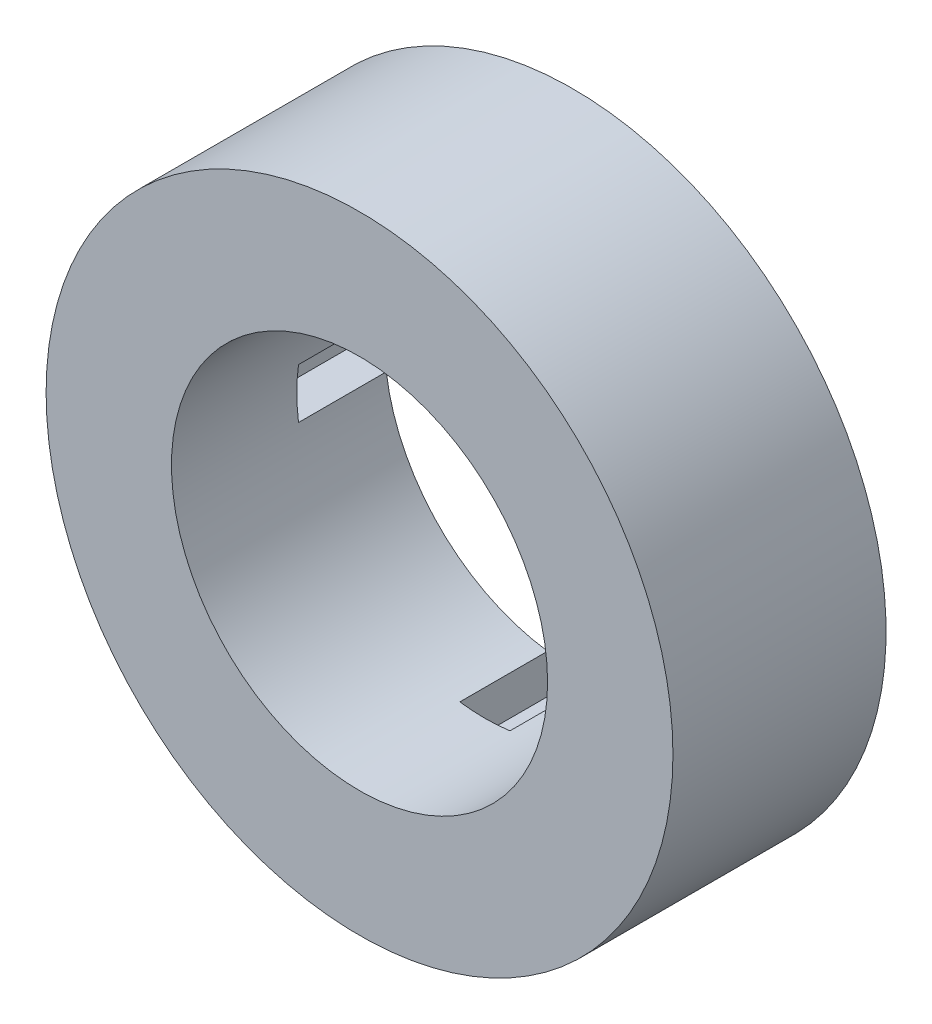
ISO-10303-21;
HEADER;
FILE_DESCRIPTION(('STEP AP214'),'2;1');
FILE_NAME('part.step','',(''),(''),'','','');
FILE_SCHEMA(('AUTOMOTIVE_DESIGN { 1 0 10303 214 1 1 1 1 }'));
ENDSEC;
DATA;
#1=APPLICATION_CONTEXT('core data for automotive mechanical design processes');
#2=APPLICATION_PROTOCOL_DEFINITION('international standard','automotive_design',2000,#1);
#3=PRODUCT_CONTEXT('',#1,'mechanical');
#4=PRODUCT('Part','Part','',(#3));
#5=PRODUCT_RELATED_PRODUCT_CATEGORY('part','',(#4));
#6=PRODUCT_DEFINITION_FORMATION('','',#4);
#7=PRODUCT_DEFINITION_CONTEXT('part definition',#1,'design');
#8=PRODUCT_DEFINITION('design','',#6,#7);
#9=PRODUCT_DEFINITION_SHAPE('','',#8);
#10=(LENGTH_UNIT() NAMED_UNIT(*) SI_UNIT(.MILLI.,.METRE.));
#11=(NAMED_UNIT(*) PLANE_ANGLE_UNIT() SI_UNIT($,.RADIAN.));
#12=(NAMED_UNIT(*) SI_UNIT($,.STERADIAN.) SOLID_ANGLE_UNIT());
#13=UNCERTAINTY_MEASURE_WITH_UNIT(LENGTH_MEASURE(1.E-05),#10,'distance_accuracy_value','');
#14=(GEOMETRIC_REPRESENTATION_CONTEXT(3) GLOBAL_UNCERTAINTY_ASSIGNED_CONTEXT((#13)) GLOBAL_UNIT_ASSIGNED_CONTEXT((#10,
#11,#12)) REPRESENTATION_CONTEXT('',''));
#15=CARTESIAN_POINT('',(0.,0.,0.));
#16=DIRECTION('',(0.,0.,1.));
#17=DIRECTION('',(1.,0.,0.));
#18=AXIS2_PLACEMENT_3D('',#15,#16,#17);
#19=CARTESIAN_POINT('',(0.,0.,5.));
#20=DIRECTION('',(0.,0.,-1.));
#21=DIRECTION('',(-1.,0.,0.));
#22=AXIS2_PLACEMENT_3D('',#19,#20,#21);
#23=CYLINDRICAL_SURFACE('',#22,3.75);
#24=CARTESIAN_POINT('',(0.,0.,5.));
#25=DIRECTION('',(0.,0.,1.));
#26=DIRECTION('',(1.,0.,0.));
#27=AXIS2_PLACEMENT_3D('',#24,#25,#26);
#28=CIRCLE('',#27,3.75);
#29=CARTESIAN_POINT('',(3.75,0.,5.));
#30=VERTEX_POINT('',#29);
#31=EDGE_CURVE('E263',#30,#30,#28,.T.);
#32=ORIENTED_EDGE('',*,*,#31,.T.);
#33=EDGE_LOOP('',(#32));
#34=FACE_BOUND('',#33,.T.);
#35=DIRECTION('',(0.,0.,-1.));
#36=VECTOR('',#35,1.);
#37=CARTESIAN_POINT('',(-3.71651718682963,0.5,5.));
#38=LINE('',#37,#36);
#39=CARTESIAN_POINT('',(-3.71651718682963,0.5,2.5));
#40=VERTEX_POINT('',#39);
#41=CARTESIAN_POINT('',(-3.71651718682963,0.5,0.75));
#42=VERTEX_POINT('',#41);
#43=EDGE_CURVE('E255',#40,#42,#38,.T.);
#44=ORIENTED_EDGE('',*,*,#43,.T.);
#45=CARTESIAN_POINT('',(0.,0.,0.75));
#46=DIRECTION('',(0.,0.,-1.));
#47=DIRECTION('',(-1.,0.,0.));
#48=AXIS2_PLACEMENT_3D('',#45,#46,#47);
#49=CIRCLE('',#48,3.75);
#50=CARTESIAN_POINT('',(-0.5,3.71651718682963,0.750000000000001));
#51=VERTEX_POINT('',#50);
#52=EDGE_CURVE('E337',#42,#51,#49,.T.);
#53=ORIENTED_EDGE('',*,*,#52,.T.);
#54=DIRECTION('',(0.,0.,-1.));
#55=VECTOR('',#54,1.);
#56=CARTESIAN_POINT('',(-0.5,3.71651718682963,5.));
#57=LINE('',#56,#55);
#58=CARTESIAN_POINT('',(-0.5,3.71651718682963,2.5));
#59=VERTEX_POINT('',#58);
#60=EDGE_CURVE('E167',#51,#59,#57,.F.);
#61=ORIENTED_EDGE('',*,*,#60,.T.);
#62=CARTESIAN_POINT('',(0.,0.,2.5));
#63=DIRECTION('',(0.,0.,-1.));
#64=DIRECTION('',(-1.,0.,0.));
#65=AXIS2_PLACEMENT_3D('',#62,#63,#64);
#66=CIRCLE('',#65,3.75);
#67=CARTESIAN_POINT('',(0.5,3.71651718682963,2.5));
#68=VERTEX_POINT('',#67);
#69=EDGE_CURVE('E51',#59,#68,#66,.T.);
#70=ORIENTED_EDGE('',*,*,#69,.T.);
#71=DIRECTION('',(0.,0.,-1.));
#72=VECTOR('',#71,1.);
#73=CARTESIAN_POINT('',(0.5,3.71651718682963,5.));
#74=LINE('',#73,#72);
#75=CARTESIAN_POINT('',(0.5,3.71651718682963,0.750000000000001));
#76=VERTEX_POINT('',#75);
#77=EDGE_CURVE('E64',#68,#76,#74,.T.);
#78=ORIENTED_EDGE('',*,*,#77,.T.);
#79=CARTESIAN_POINT('',(3.71651718682963,0.499999999999999,0.75));
#80=VERTEX_POINT('',#79);
#81=EDGE_CURVE('E338',#76,#80,#49,.T.);
#82=ORIENTED_EDGE('',*,*,#81,.T.);
#83=DIRECTION('',(0.,0.,-1.));
#84=VECTOR('',#83,1.);
#85=CARTESIAN_POINT('',(3.71651718682963,0.499999999999999,5.));
#86=LINE('',#85,#84);
#87=CARTESIAN_POINT('',(3.71651718682963,0.499999999999999,2.5));
#88=VERTEX_POINT('',#87);
#89=EDGE_CURVE('E176',#80,#88,#86,.F.);
#90=ORIENTED_EDGE('',*,*,#89,.T.);
#91=CARTESIAN_POINT('',(0.,0.,2.5));
#92=DIRECTION('',(0.,0.,1.));
#93=DIRECTION('',(1.,0.,0.));
#94=AXIS2_PLACEMENT_3D('',#91,#92,#93);
#95=CIRCLE('',#94,3.75);
#96=CARTESIAN_POINT('',(3.71651718682963,-0.500000000000001,2.5));
#97=VERTEX_POINT('',#96);
#98=EDGE_CURVE('E271',#97,#88,#95,.T.);
#99=ORIENTED_EDGE('',*,*,#98,.F.);
#100=DIRECTION('',(0.,0.,-1.));
#101=VECTOR('',#100,1.);
#102=CARTESIAN_POINT('',(3.71651718682963,-0.5,5.));
#103=LINE('',#102,#101);
#104=CARTESIAN_POINT('',(3.71651718682963,-0.500000000000001,0.750000000000001));
#105=VERTEX_POINT('',#104);
#106=EDGE_CURVE('E181',#97,#105,#103,.T.);
#107=ORIENTED_EDGE('',*,*,#106,.T.);
#108=CARTESIAN_POINT('',(0.499999999999999,-3.71651718682963,0.75));
#109=VERTEX_POINT('',#108);
#110=EDGE_CURVE('E311',#105,#109,#49,.T.);
#111=ORIENTED_EDGE('',*,*,#110,.T.);
#112=DIRECTION('',(0.,0.,-1.));
#113=VECTOR('',#112,1.);
#114=CARTESIAN_POINT('',(0.499999999999999,-3.71651718682963,5.));
#115=LINE('',#114,#113);
#116=CARTESIAN_POINT('',(0.499999999999999,-3.71651718682963,2.5));
#117=VERTEX_POINT('',#116);
#118=EDGE_CURVE('E245',#109,#117,#115,.F.);
#119=ORIENTED_EDGE('',*,*,#118,.T.);
#120=CARTESIAN_POINT('',(0.,0.,2.5));
#121=DIRECTION('',(0.,0.,1.));
#122=DIRECTION('',(1.,0.,0.));
#123=AXIS2_PLACEMENT_3D('',#120,#121,#122);
#124=CIRCLE('',#123,3.75);
#125=CARTESIAN_POINT('',(-0.500000000000001,-3.71651718682963,2.5));
#126=VERTEX_POINT('',#125);
#127=EDGE_CURVE('E275',#126,#117,#124,.T.);
#128=ORIENTED_EDGE('',*,*,#127,.F.);
#129=DIRECTION('',(0.,0.,-1.));
#130=VECTOR('',#129,1.);
#131=CARTESIAN_POINT('',(-0.5,-3.71651718682963,5.));
#132=LINE('',#131,#130);
#133=CARTESIAN_POINT('',(-0.5,-3.71651718682963,0.75));
#134=VERTEX_POINT('',#133);
#135=EDGE_CURVE('E248',#126,#134,#132,.T.);
#136=ORIENTED_EDGE('',*,*,#135,.T.);
#137=CARTESIAN_POINT('',(-3.71651718682963,-0.5,0.750000000000001));
#138=VERTEX_POINT('',#137);
#139=EDGE_CURVE('E316',#134,#138,#49,.T.);
#140=ORIENTED_EDGE('',*,*,#139,.T.);
#141=DIRECTION('',(0.,0.,-1.));
#142=VECTOR('',#141,1.);
#143=CARTESIAN_POINT('',(-3.71651718682963,-0.499999999999999,5.));
#144=LINE('',#143,#142);
#145=CARTESIAN_POINT('',(-3.71651718682963,-0.5,2.5));
#146=VERTEX_POINT('',#145);
#147=EDGE_CURVE('E252',#138,#146,#144,.F.);
#148=ORIENTED_EDGE('',*,*,#147,.T.);
#149=CARTESIAN_POINT('',(0.,0.,2.5));
#150=DIRECTION('',(0.,0.,1.));
#151=DIRECTION('',(1.,0.,0.));
#152=AXIS2_PLACEMENT_3D('',#149,#150,#151);
#153=CIRCLE('',#152,3.75);
#154=EDGE_CURVE('E279',#40,#146,#153,.T.);
#155=ORIENTED_EDGE('',*,*,#154,.F.);
#156=EDGE_LOOP('',(#44,#53,#61,#70,#78,#82,#90,#99,#107,#111,#119,#128,#136,#140,#148,#155));
#157=FACE_BOUND('',#156,.T.);
#158=ADVANCED_FACE('F42',(#34,#157),#23,.F.);
#159=CARTESIAN_POINT('',(0.,0.,5.));
#160=DIRECTION('',(0.,0.,-1.));
#161=DIRECTION('',(-1.,0.,0.));
#162=AXIS2_PLACEMENT_3D('',#159,#160,#161);
#163=CYLINDRICAL_SURFACE('',#162,6.25);
#164=CARTESIAN_POINT('',(0.,0.,5.));
#165=DIRECTION('',(0.,0.,1.));
#166=DIRECTION('',(1.,0.,0.));
#167=AXIS2_PLACEMENT_3D('',#164,#165,#166);
#168=CIRCLE('',#167,6.25);
#169=CARTESIAN_POINT('',(6.25,0.,5.));
#170=VERTEX_POINT('',#169);
#171=EDGE_CURVE('E267',#170,#170,#168,.T.);
#172=ORIENTED_EDGE('',*,*,#171,.F.);
#173=EDGE_LOOP('',(#172));
#174=FACE_BOUND('',#173,.T.);
#175=CARTESIAN_POINT('',(0.,0.,0.75));
#176=DIRECTION('',(0.,0.,-1.));
#177=DIRECTION('',(-1.,0.,0.));
#178=AXIS2_PLACEMENT_3D('',#175,#176,#177);
#179=CIRCLE('',#178,6.25);
#180=CARTESIAN_POINT('',(-6.25,0.,0.75));
#181=VERTEX_POINT('',#180);
#182=EDGE_CURVE('E229',#181,#181,#179,.T.);
#183=ORIENTED_EDGE('',*,*,#182,.F.);
#184=EDGE_LOOP('',(#183));
#185=FACE_BOUND('',#184,.T.);
#186=ADVANCED_FACE('F44',(#174,#185),#163,.T.);
#187=CARTESIAN_POINT('',(4.5,-0.500000000000001,-9.5));
#188=DIRECTION('',(-1.,0.,0.));
#189=DIRECTION('',(0.,0.,1.));
#190=AXIS2_PLACEMENT_3D('',#187,#188,#189);
#191=PLANE('',#190);
#192=DIRECTION('',(0.,0.,1.));
#193=VECTOR('',#192,1.);
#194=CARTESIAN_POINT('',(4.5,0.499999999999999,-9.5));
#195=LINE('',#194,#193);
#196=CARTESIAN_POINT('',(4.5,0.499999999999999,0.750000000000001));
#197=VERTEX_POINT('',#196);
#198=CARTESIAN_POINT('',(4.5,0.499999999999999,2.5));
#199=VERTEX_POINT('',#198);
#200=EDGE_CURVE('E237',#197,#199,#195,.T.);
#201=ORIENTED_EDGE('',*,*,#200,.F.);
#202=DIRECTION('',(0.,-1.,0.));
#203=VECTOR('',#202,1.);
#204=CARTESIAN_POINT('',(4.5,-0.500000000000001,0.750000000000001));
#205=LINE('',#204,#203);
#206=CARTESIAN_POINT('',(4.5,-0.500000000000001,0.750000000000001));
#207=VERTEX_POINT('',#206);
#208=EDGE_CURVE('E321',#197,#207,#205,.T.);
#209=ORIENTED_EDGE('',*,*,#208,.T.);
#210=DIRECTION('',(0.,0.,1.));
#211=VECTOR('',#210,1.);
#212=CARTESIAN_POINT('',(4.5,-0.500000000000001,-9.5));
#213=LINE('',#212,#211);
#214=CARTESIAN_POINT('',(4.5,-0.500000000000001,2.5));
#215=VERTEX_POINT('',#214);
#216=EDGE_CURVE('E211',#207,#215,#213,.T.);
#217=ORIENTED_EDGE('',*,*,#216,.T.);
#218=DIRECTION('',(0.,-1.,0.));
#219=VECTOR('',#218,1.);
#220=CARTESIAN_POINT('',(4.5,-0.500000000000001,2.5));
#221=LINE('',#220,#219);
#222=EDGE_CURVE('E224',#199,#215,#221,.T.);
#223=ORIENTED_EDGE('',*,*,#222,.F.);
#224=EDGE_LOOP('',(#201,#209,#217,#223));
#225=FACE_BOUND('',#224,.T.);
#226=ADVANCED_FACE('F412',(#225),#191,.T.);
#227=CARTESIAN_POINT('',(4.5,-0.500000000000001,-9.5));
#228=DIRECTION('',(0.,1.,0.));
#229=DIRECTION('',(-1.,0.,0.));
#230=AXIS2_PLACEMENT_3D('',#227,#228,#229);
#231=PLANE('',#230);
#232=ORIENTED_EDGE('',*,*,#216,.F.);
#233=DIRECTION('',(-1.,0.,0.));
#234=VECTOR('',#233,1.);
#235=CARTESIAN_POINT('',(4.5,-0.500000000000001,0.750000000000001));
#236=LINE('',#235,#234);
#237=EDGE_CURVE('E312',#207,#105,#236,.T.);
#238=ORIENTED_EDGE('',*,*,#237,.T.);
#239=ORIENTED_EDGE('',*,*,#106,.F.);
#240=DIRECTION('',(-1.,0.,0.));
#241=VECTOR('',#240,1.);
#242=CARTESIAN_POINT('',(4.5,-0.500000000000001,2.5));
#243=LINE('',#242,#241);
#244=EDGE_CURVE('E228',#215,#97,#243,.T.);
#245=ORIENTED_EDGE('',*,*,#244,.F.);
#246=EDGE_LOOP('',(#232,#238,#239,#245));
#247=FACE_BOUND('',#246,.T.);
#248=ADVANCED_FACE('F475',(#247),#231,.T.);
#249=CARTESIAN_POINT('',(4.5,0.499999999999999,-9.5));
#250=DIRECTION('',(0.,-1.,0.));
#251=DIRECTION('',(1.,0.,0.));
#252=AXIS2_PLACEMENT_3D('',#249,#250,#251);
#253=PLANE('',#252);
#254=ORIENTED_EDGE('',*,*,#89,.F.);
#255=DIRECTION('',(1.,0.,0.));
#256=VECTOR('',#255,1.);
#257=CARTESIAN_POINT('',(4.5,0.499999999999999,0.750000000000001));
#258=LINE('',#257,#256);
#259=EDGE_CURVE('E325',#80,#197,#258,.T.);
#260=ORIENTED_EDGE('',*,*,#259,.T.);
#261=ORIENTED_EDGE('',*,*,#200,.T.);
#262=DIRECTION('',(1.,0.,0.));
#263=VECTOR('',#262,1.);
#264=CARTESIAN_POINT('',(4.5,0.499999999999999,2.5));
#265=LINE('',#264,#263);
#266=EDGE_CURVE('E233',#88,#199,#265,.T.);
#267=ORIENTED_EDGE('',*,*,#266,.F.);
#268=EDGE_LOOP('',(#254,#260,#261,#267));
#269=FACE_BOUND('',#268,.T.);
#270=ADVANCED_FACE('F471',(#269),#253,.T.);
#271=CARTESIAN_POINT('',(-0.500000000000001,-4.5,-9.5));
#272=DIRECTION('',(0.,1.,0.));
#273=DIRECTION('',(0.,0.,1.));
#274=AXIS2_PLACEMENT_3D('',#271,#272,#273);
#275=PLANE('',#274);
#276=DIRECTION('',(0.,0.,1.));
#277=VECTOR('',#276,1.);
#278=CARTESIAN_POINT('',(0.499999999999999,-4.5,-9.5));
#279=LINE('',#278,#277);
#280=CARTESIAN_POINT('',(0.499999999999999,-4.5,0.750000000000001));
#281=VERTEX_POINT('',#280);
#282=CARTESIAN_POINT('',(0.499999999999999,-4.5,2.5));
#283=VERTEX_POINT('',#282);
#284=EDGE_CURVE('E219',#281,#283,#279,.T.);
#285=ORIENTED_EDGE('',*,*,#284,.F.);
#286=DIRECTION('',(-1.,0.,0.));
#287=VECTOR('',#286,1.);
#288=CARTESIAN_POINT('',(-0.500000000000001,-4.5,0.750000000000001));
#289=LINE('',#288,#287);
#290=CARTESIAN_POINT('',(-0.500000000000001,-4.5,0.750000000000001));
#291=VERTEX_POINT('',#290);
#292=EDGE_CURVE('E299',#281,#291,#289,.T.);
#293=ORIENTED_EDGE('',*,*,#292,.T.);
#294=DIRECTION('',(0.,0.,1.));
#295=VECTOR('',#294,1.);
#296=CARTESIAN_POINT('',(-0.500000000000001,-4.5,-9.5));
#297=LINE('',#296,#295);
#298=CARTESIAN_POINT('',(-0.500000000000001,-4.5,2.5));
#299=VERTEX_POINT('',#298);
#300=EDGE_CURVE('E191',#291,#299,#297,.T.);
#301=ORIENTED_EDGE('',*,*,#300,.T.);
#302=DIRECTION('',(-1.,0.,0.));
#303=VECTOR('',#302,1.);
#304=CARTESIAN_POINT('',(-0.500000000000001,-4.5,2.5));
#305=LINE('',#304,#303);
#306=EDGE_CURVE('E206',#283,#299,#305,.T.);
#307=ORIENTED_EDGE('',*,*,#306,.F.);
#308=EDGE_LOOP('',(#285,#293,#301,#307));
#309=FACE_BOUND('',#308,.T.);
#310=ADVANCED_FACE('F468',(#309),#275,.T.);
#311=CARTESIAN_POINT('',(-0.500000000000001,-4.5,-9.5));
#312=DIRECTION('',(1.,0.,0.));
#313=DIRECTION('',(0.,1.,0.));
#314=AXIS2_PLACEMENT_3D('',#311,#312,#313);
#315=PLANE('',#314);
#316=ORIENTED_EDGE('',*,*,#300,.F.);
#317=DIRECTION('',(0.,1.,0.));
#318=VECTOR('',#317,1.);
#319=CARTESIAN_POINT('',(-0.500000000000001,-4.5,0.750000000000001));
#320=LINE('',#319,#318);
#321=EDGE_CURVE('E303',#291,#134,#320,.T.);
#322=ORIENTED_EDGE('',*,*,#321,.T.);
#323=ORIENTED_EDGE('',*,*,#135,.F.);
#324=DIRECTION('',(0.,1.,0.));
#325=VECTOR('',#324,1.);
#326=CARTESIAN_POINT('',(-0.500000000000001,-4.5,2.5));
#327=LINE('',#326,#325);
#328=EDGE_CURVE('E210',#299,#126,#327,.T.);
#329=ORIENTED_EDGE('',*,*,#328,.F.);
#330=EDGE_LOOP('',(#316,#322,#323,#329));
#331=FACE_BOUND('',#330,.T.);
#332=ADVANCED_FACE('F464',(#331),#315,.T.);
#333=CARTESIAN_POINT('',(0.499999999999999,-4.5,-9.5));
#334=DIRECTION('',(-1.,0.,0.));
#335=DIRECTION('',(0.,-1.,0.));
#336=AXIS2_PLACEMENT_3D('',#333,#334,#335);
#337=PLANE('',#336);
#338=ORIENTED_EDGE('',*,*,#118,.F.);
#339=DIRECTION('',(0.,-1.,0.));
#340=VECTOR('',#339,1.);
#341=CARTESIAN_POINT('',(0.499999999999999,-4.5,0.750000000000001));
#342=LINE('',#341,#340);
#343=EDGE_CURVE('E307',#109,#281,#342,.T.);
#344=ORIENTED_EDGE('',*,*,#343,.T.);
#345=ORIENTED_EDGE('',*,*,#284,.T.);
#346=DIRECTION('',(0.,-1.,0.));
#347=VECTOR('',#346,1.);
#348=CARTESIAN_POINT('',(0.499999999999999,-4.5,2.5));
#349=LINE('',#348,#347);
#350=EDGE_CURVE('E215',#117,#283,#349,.T.);
#351=ORIENTED_EDGE('',*,*,#350,.F.);
#352=EDGE_LOOP('',(#338,#344,#345,#351));
#353=FACE_BOUND('',#352,.T.);
#354=ADVANCED_FACE('F457',(#353),#337,.T.);
#355=CARTESIAN_POINT('',(-4.5,0.5,-9.5));
#356=DIRECTION('',(1.,0.,0.));
#357=DIRECTION('',(0.,0.,-1.));
#358=AXIS2_PLACEMENT_3D('',#355,#356,#357);
#359=PLANE('',#358);
#360=DIRECTION('',(0.,0.,1.));
#361=VECTOR('',#360,1.);
#362=CARTESIAN_POINT('',(-4.5,-0.5,-9.5));
#363=LINE('',#362,#361);
#364=CARTESIAN_POINT('',(-4.5,-0.5,0.750000000000001));
#365=VERTEX_POINT('',#364);
#366=CARTESIAN_POINT('',(-4.5,-0.5,2.5));
#367=VERTEX_POINT('',#366);
#368=EDGE_CURVE('E199',#365,#367,#363,.T.);
#369=ORIENTED_EDGE('',*,*,#368,.F.);
#370=DIRECTION('',(0.,1.,0.));
#371=VECTOR('',#370,1.);
#372=CARTESIAN_POINT('',(-4.5,0.5,0.750000000000001));
#373=LINE('',#372,#371);
#374=CARTESIAN_POINT('',(-4.5,0.5,0.750000000000001));
#375=VERTEX_POINT('',#374);
#376=EDGE_CURVE('E329',#365,#375,#373,.T.);
#377=ORIENTED_EDGE('',*,*,#376,.T.);
#378=DIRECTION('',(0.,0.,1.));
#379=VECTOR('',#378,1.);
#380=CARTESIAN_POINT('',(-4.5,0.5,-9.5));
#381=LINE('',#380,#379);
#382=CARTESIAN_POINT('',(-4.5,0.5,2.5));
#383=VERTEX_POINT('',#382);
#384=EDGE_CURVE('E202',#375,#383,#381,.T.);
#385=ORIENTED_EDGE('',*,*,#384,.T.);
#386=DIRECTION('',(0.,1.,0.));
#387=VECTOR('',#386,1.);
#388=CARTESIAN_POINT('',(-4.5,0.5,2.5));
#389=LINE('',#388,#387);
#390=EDGE_CURVE('E186',#367,#383,#389,.T.);
#391=ORIENTED_EDGE('',*,*,#390,.F.);
#392=EDGE_LOOP('',(#369,#377,#385,#391));
#393=FACE_BOUND('',#392,.T.);
#394=ADVANCED_FACE('F453',(#393),#359,.T.);
#395=CARTESIAN_POINT('',(-4.5,0.5,-9.5));
#396=DIRECTION('',(0.,-1.,0.));
#397=DIRECTION('',(1.,0.,0.));
#398=AXIS2_PLACEMENT_3D('',#395,#396,#397);
#399=PLANE('',#398);
#400=ORIENTED_EDGE('',*,*,#384,.F.);
#401=DIRECTION('',(1.,0.,0.));
#402=VECTOR('',#401,1.);
#403=CARTESIAN_POINT('',(-4.5,0.5,0.750000000000001));
#404=LINE('',#403,#402);
#405=EDGE_CURVE('E333',#375,#42,#404,.T.);
#406=ORIENTED_EDGE('',*,*,#405,.T.);
#407=ORIENTED_EDGE('',*,*,#43,.F.);
#408=DIRECTION('',(1.,0.,0.));
#409=VECTOR('',#408,1.);
#410=CARTESIAN_POINT('',(-4.5,0.5,2.5));
#411=LINE('',#410,#409);
#412=EDGE_CURVE('E190',#383,#40,#411,.T.);
#413=ORIENTED_EDGE('',*,*,#412,.F.);
#414=EDGE_LOOP('',(#400,#406,#407,#413));
#415=FACE_BOUND('',#414,.T.);
#416=ADVANCED_FACE('F449',(#415),#399,.T.);
#417=CARTESIAN_POINT('',(-4.5,-0.5,-9.5));
#418=DIRECTION('',(0.,1.,0.));
#419=DIRECTION('',(-1.,0.,0.));
#420=AXIS2_PLACEMENT_3D('',#417,#418,#419);
#421=PLANE('',#420);
#422=ORIENTED_EDGE('',*,*,#147,.F.);
#423=DIRECTION('',(-1.,0.,0.));
#424=VECTOR('',#423,1.);
#425=CARTESIAN_POINT('',(-4.5,-0.5,0.750000000000001));
#426=LINE('',#425,#424);
#427=EDGE_CURVE('E317',#138,#365,#426,.T.);
#428=ORIENTED_EDGE('',*,*,#427,.T.);
#429=ORIENTED_EDGE('',*,*,#368,.T.);
#430=DIRECTION('',(-1.,0.,0.));
#431=VECTOR('',#430,1.);
#432=CARTESIAN_POINT('',(-4.5,-0.5,2.5));
#433=LINE('',#432,#431);
#434=EDGE_CURVE('E195',#146,#367,#433,.T.);
#435=ORIENTED_EDGE('',*,*,#434,.F.);
#436=EDGE_LOOP('',(#422,#428,#429,#435));
#437=FACE_BOUND('',#436,.T.);
#438=ADVANCED_FACE('F442',(#437),#421,.T.);
#439=CARTESIAN_POINT('',(0.5,4.5,-9.5));
#440=DIRECTION('',(-1.,0.,0.));
#441=DIRECTION('',(0.,0.,1.));
#442=AXIS2_PLACEMENT_3D('',#439,#440,#441);
#443=PLANE('',#442);
#444=DIRECTION('',(0.,0.,1.));
#445=VECTOR('',#444,1.);
#446=CARTESIAN_POINT('',(0.5,4.5,-9.5));
#447=LINE('',#446,#445);
#448=CARTESIAN_POINT('',(0.5,4.5,0.749999999999997));
#449=VERTEX_POINT('',#448);
#450=CARTESIAN_POINT('',(0.5,4.5,2.5));
#451=VERTEX_POINT('',#450);
#452=EDGE_CURVE('E177',#449,#451,#447,.T.);
#453=ORIENTED_EDGE('',*,*,#452,.F.);
#454=DIRECTION('',(0.,-1.,0.));
#455=VECTOR('',#454,1.);
#456=CARTESIAN_POINT('',(0.5,4.5,0.750000000000001));
#457=LINE('',#456,#455);
#458=EDGE_CURVE('E58',#449,#76,#457,.T.);
#459=ORIENTED_EDGE('',*,*,#458,.T.);
#460=ORIENTED_EDGE('',*,*,#77,.F.);
#461=DIRECTION('',(0.,-1.,0.));
#462=VECTOR('',#461,1.);
#463=CARTESIAN_POINT('',(0.5,4.5,2.5));
#464=LINE('',#463,#462);
#465=EDGE_CURVE('E205',#451,#68,#464,.T.);
#466=ORIENTED_EDGE('',*,*,#465,.F.);
#467=EDGE_LOOP('',(#453,#459,#460,#466));
#468=FACE_BOUND('',#467,.T.);
#469=ADVANCED_FACE('F436',(#468),#443,.T.);
#470=CARTESIAN_POINT('',(-0.5,4.5,-9.5));
#471=DIRECTION('',(1.,0.,0.));
#472=DIRECTION('',(0.,0.,-1.));
#473=AXIS2_PLACEMENT_3D('',#470,#471,#472);
#474=PLANE('',#473);
#475=ORIENTED_EDGE('',*,*,#60,.F.);
#476=DIRECTION('',(0.,1.,0.));
#477=VECTOR('',#476,1.);
#478=CARTESIAN_POINT('',(-0.5,4.5,0.750000000000001));
#479=LINE('',#478,#477);
#480=CARTESIAN_POINT('',(-0.5,4.5,0.750000000000001));
#481=VERTEX_POINT('',#480);
#482=EDGE_CURVE('E156',#51,#481,#479,.T.);
#483=ORIENTED_EDGE('',*,*,#482,.T.);
#484=DIRECTION('',(0.,0.,1.));
#485=VECTOR('',#484,1.);
#486=CARTESIAN_POINT('',(-0.5,4.5,-9.5));
#487=LINE('',#486,#485);
#488=CARTESIAN_POINT('',(-0.5,4.5,2.5));
#489=VERTEX_POINT('',#488);
#490=EDGE_CURVE('E165',#481,#489,#487,.T.);
#491=ORIENTED_EDGE('',*,*,#490,.T.);
#492=DIRECTION('',(0.,1.,0.));
#493=VECTOR('',#492,1.);
#494=CARTESIAN_POINT('',(-0.5,4.5,2.5));
#495=LINE('',#494,#493);
#496=EDGE_CURVE('E289',#59,#489,#495,.T.);
#497=ORIENTED_EDGE('',*,*,#496,.F.);
#498=EDGE_LOOP('',(#475,#483,#491,#497));
#499=FACE_BOUND('',#498,.T.);
#500=ADVANCED_FACE('F163',(#499),#474,.T.);
#501=CARTESIAN_POINT('',(0.5,4.5,-9.5));
#502=DIRECTION('',(0.,-1.,0.));
#503=DIRECTION('',(0.,0.,-1.));
#504=AXIS2_PLACEMENT_3D('',#501,#502,#503);
#505=PLANE('',#504);
#506=ORIENTED_EDGE('',*,*,#490,.F.);
#507=DIRECTION('',(1.,0.,0.));
#508=VECTOR('',#507,1.);
#509=CARTESIAN_POINT('',(0.5,4.5,0.750000000000001));
#510=LINE('',#509,#508);
#511=EDGE_CURVE('E12',#481,#449,#510,.T.);
#512=ORIENTED_EDGE('',*,*,#511,.T.);
#513=ORIENTED_EDGE('',*,*,#452,.T.);
#514=DIRECTION('',(1.,0.,0.));
#515=VECTOR('',#514,1.);
#516=CARTESIAN_POINT('',(0.5,4.5,2.5));
#517=LINE('',#516,#515);
#518=EDGE_CURVE('E174',#489,#451,#517,.T.);
#519=ORIENTED_EDGE('',*,*,#518,.F.);
#520=EDGE_LOOP('',(#506,#512,#513,#519));
#521=FACE_BOUND('',#520,.T.);
#522=ADVANCED_FACE('F172',(#521),#505,.T.);
#523=CARTESIAN_POINT('',(0.,0.,5.));
#524=DIRECTION('',(0.,0.,1.));
#525=DIRECTION('',(1.,0.,0.));
#526=AXIS2_PLACEMENT_3D('',#523,#524,#525);
#527=PLANE('',#526);
#528=ORIENTED_EDGE('',*,*,#171,.T.);
#529=EDGE_LOOP('',(#528));
#530=FACE_BOUND('',#529,.T.);
#531=ORIENTED_EDGE('',*,*,#31,.F.);
#532=EDGE_LOOP('',(#531));
#533=FACE_BOUND('',#532,.T.);
#534=ADVANCED_FACE('F416',(#530,#533),#527,.T.);
#535=CARTESIAN_POINT('',(0.,0.,2.5));
#536=DIRECTION('',(0.,0.,1.));
#537=DIRECTION('',(1.,0.,0.));
#538=AXIS2_PLACEMENT_3D('',#535,#536,#537);
#539=PLANE('',#538);
#540=ORIENTED_EDGE('',*,*,#98,.T.);
#541=ORIENTED_EDGE('',*,*,#266,.T.);
#542=ORIENTED_EDGE('',*,*,#222,.T.);
#543=ORIENTED_EDGE('',*,*,#244,.T.);
#544=EDGE_LOOP('',(#540,#541,#542,#543));
#545=FACE_BOUND('',#544,.T.);
#546=ADVANCED_FACE('F418',(#545),#539,.F.);
#547=CARTESIAN_POINT('',(0.,0.,2.5));
#548=DIRECTION('',(0.,0.,1.));
#549=DIRECTION('',(1.,0.,0.));
#550=AXIS2_PLACEMENT_3D('',#547,#548,#549);
#551=PLANE('',#550);
#552=ORIENTED_EDGE('',*,*,#127,.T.);
#553=ORIENTED_EDGE('',*,*,#350,.T.);
#554=ORIENTED_EDGE('',*,*,#306,.T.);
#555=ORIENTED_EDGE('',*,*,#328,.T.);
#556=EDGE_LOOP('',(#552,#553,#554,#555));
#557=FACE_BOUND('',#556,.T.);
#558=ADVANCED_FACE('F423',(#557),#551,.F.);
#559=CARTESIAN_POINT('',(0.,0.,2.5));
#560=DIRECTION('',(0.,0.,1.));
#561=DIRECTION('',(1.,0.,0.));
#562=AXIS2_PLACEMENT_3D('',#559,#560,#561);
#563=PLANE('',#562);
#564=ORIENTED_EDGE('',*,*,#154,.T.);
#565=ORIENTED_EDGE('',*,*,#434,.T.);
#566=ORIENTED_EDGE('',*,*,#390,.T.);
#567=ORIENTED_EDGE('',*,*,#412,.T.);
#568=EDGE_LOOP('',(#564,#565,#566,#567));
#569=FACE_BOUND('',#568,.T.);
#570=ADVANCED_FACE('F443',(#569),#563,.F.);
#571=CARTESIAN_POINT('',(0.,0.,2.5));
#572=DIRECTION('',(0.,0.,-1.));
#573=DIRECTION('',(-1.,0.,0.));
#574=AXIS2_PLACEMENT_3D('',#571,#572,#573);
#575=PLANE('',#574);
#576=ORIENTED_EDGE('',*,*,#496,.T.);
#577=ORIENTED_EDGE('',*,*,#518,.T.);
#578=ORIENTED_EDGE('',*,*,#465,.T.);
#579=ORIENTED_EDGE('',*,*,#69,.F.);
#580=EDGE_LOOP('',(#576,#577,#578,#579));
#581=FACE_BOUND('',#580,.T.);
#582=ADVANCED_FACE('F288',(#581),#575,.T.);
#583=CARTESIAN_POINT('',(-9.21897987228196,10.,0.75));
#584=DIRECTION('',(0.,0.,-1.));
#585=DIRECTION('',(-1.,0.,0.));
#586=AXIS2_PLACEMENT_3D('',#583,#584,#585);
#587=PLANE('',#586);
#588=CARTESIAN_POINT('',(3.53553390593271,-3.53553390593277,0.75));
#589=DIRECTION('',(0.,0.,-1.));
#590=DIRECTION('',(0.,1.,0.));
#591=AXIS2_PLACEMENT_3D('',#588,#589,#590);
#592=CIRCLE('',#591,0.5);
#593=CARTESIAN_POINT('',(3.53553390593271,-3.03553390593277,0.75));
#594=VERTEX_POINT('',#593);
#595=EDGE_CURVE('E367',#594,#594,#592,.T.);
#596=ORIENTED_EDGE('',*,*,#595,.F.);
#597=EDGE_LOOP('',(#596));
#598=FACE_BOUND('',#597,.T.);
#599=CARTESIAN_POINT('',(-3.53553390593276,-3.53553390593272,0.75));
#600=DIRECTION('',(0.,0.,-1.));
#601=DIRECTION('',(1.,0.,0.));
#602=AXIS2_PLACEMENT_3D('',#599,#600,#601);
#603=CIRCLE('',#602,0.5);
#604=CARTESIAN_POINT('',(-3.03553390593276,-3.53553390593272,0.75));
#605=VERTEX_POINT('',#604);
#606=EDGE_CURVE('E359',#605,#605,#603,.T.);
#607=ORIENTED_EDGE('',*,*,#606,.F.);
#608=EDGE_LOOP('',(#607));
#609=FACE_BOUND('',#608,.T.);
#610=CARTESIAN_POINT('',(-3.53553390593268,3.53553390593279,0.75));
#611=DIRECTION('',(0.,0.,-1.));
#612=DIRECTION('',(0.,-1.,0.));
#613=AXIS2_PLACEMENT_3D('',#610,#611,#612);
#614=CIRCLE('',#613,0.5);
#615=CARTESIAN_POINT('',(-3.53553390593269,3.03553390593279,0.75));
#616=VERTEX_POINT('',#615);
#617=EDGE_CURVE('E351',#616,#616,#614,.T.);
#618=ORIENTED_EDGE('',*,*,#617,.F.);
#619=EDGE_LOOP('',(#618));
#620=FACE_BOUND('',#619,.T.);
#621=CARTESIAN_POINT('',(3.53553390593276,3.53553390593272,0.75));
#622=DIRECTION('',(0.,0.,-1.));
#623=DIRECTION('',(-1.,0.,0.));
#624=AXIS2_PLACEMENT_3D('',#621,#622,#623);
#625=CIRCLE('',#624,0.5);
#626=CARTESIAN_POINT('',(3.03553390593276,3.53553390593272,0.75));
#627=VERTEX_POINT('',#626);
#628=EDGE_CURVE('E343',#627,#627,#625,.T.);
#629=ORIENTED_EDGE('',*,*,#628,.F.);
#630=EDGE_LOOP('',(#629));
#631=FACE_BOUND('',#630,.T.);
#632=ORIENTED_EDGE('',*,*,#343,.F.);
#633=ORIENTED_EDGE('',*,*,#110,.F.);
#634=ORIENTED_EDGE('',*,*,#237,.F.);
#635=ORIENTED_EDGE('',*,*,#208,.F.);
#636=ORIENTED_EDGE('',*,*,#259,.F.);
#637=ORIENTED_EDGE('',*,*,#81,.F.);
#638=ORIENTED_EDGE('',*,*,#458,.F.);
#639=ORIENTED_EDGE('',*,*,#511,.F.);
#640=ORIENTED_EDGE('',*,*,#482,.F.);
#641=ORIENTED_EDGE('',*,*,#52,.F.);
#642=ORIENTED_EDGE('',*,*,#405,.F.);
#643=ORIENTED_EDGE('',*,*,#376,.F.);
#644=ORIENTED_EDGE('',*,*,#427,.F.);
#645=ORIENTED_EDGE('',*,*,#139,.F.);
#646=ORIENTED_EDGE('',*,*,#321,.F.);
#647=ORIENTED_EDGE('',*,*,#292,.F.);
#648=EDGE_LOOP('',(#632,#633,#634,#635,#636,#637,#638,#639,#640,#641,#642,#643,#644,#645,#646,#647));
#649=FACE_BOUND('',#648,.T.);
#650=ORIENTED_EDGE('',*,*,#182,.T.);
#651=EDGE_LOOP('',(#650));
#652=FACE_BOUND('',#651,.T.);
#653=ADVANCED_FACE('F154',(#598,#609,#620,#631,#649,#652),#587,.T.);
#654=CARTESIAN_POINT('',(3.53553390593276,3.53553390593272,3.25));
#655=DIRECTION('',(0.,0.,-1.));
#656=DIRECTION('',(-1.,0.,0.));
#657=AXIS2_PLACEMENT_3D('',#654,#655,#656);
#658=CYLINDRICAL_SURFACE('',#657,0.5);
#659=CARTESIAN_POINT('',(3.53553390593276,3.53553390593272,3.25));
#660=DIRECTION('',(0.,0.,-1.));
#661=DIRECTION('',(-1.,0.,0.));
#662=AXIS2_PLACEMENT_3D('',#659,#660,#661);
#663=CIRCLE('',#662,0.5);
#664=CARTESIAN_POINT('',(3.03553390593276,3.53553390593272,3.25));
#665=VERTEX_POINT('',#664);
#666=EDGE_CURVE('E169',#665,#665,#663,.T.);
#667=ORIENTED_EDGE('',*,*,#666,.F.);
#668=EDGE_LOOP('',(#667));
#669=FACE_BOUND('',#668,.T.);
#670=ORIENTED_EDGE('',*,*,#628,.T.);
#671=EDGE_LOOP('',(#670));
#672=FACE_BOUND('',#671,.T.);
#673=ADVANCED_FACE('F386',(#669,#672),#658,.F.);
#674=CARTESIAN_POINT('',(3.53553390593276,3.53553390593272,3.25));
#675=DIRECTION('',(0.,0.,-1.));
#676=DIRECTION('',(-1.,0.,0.));
#677=AXIS2_PLACEMENT_3D('',#674,#675,#676);
#678=PLANE('',#677);
#679=ORIENTED_EDGE('',*,*,#666,.T.);
#680=EDGE_LOOP('',(#679));
#681=FACE_BOUND('',#680,.T.);
#682=ADVANCED_FACE('F395',(#681),#678,.T.);
#683=CARTESIAN_POINT('',(-3.53553390593268,3.53553390593279,3.25));
#684=DIRECTION('',(0.,0.,-1.));
#685=DIRECTION('',(-1.,0.,0.));
#686=AXIS2_PLACEMENT_3D('',#683,#684,#685);
#687=CYLINDRICAL_SURFACE('',#686,0.5);
#688=CARTESIAN_POINT('',(-3.53553390593268,3.53553390593279,3.25));
#689=DIRECTION('',(0.,0.,-1.));
#690=DIRECTION('',(0.,-1.,0.));
#691=AXIS2_PLACEMENT_3D('',#688,#689,#690);
#692=CIRCLE('',#691,0.5);
#693=CARTESIAN_POINT('',(-3.53553390593269,3.03553390593279,3.25));
#694=VERTEX_POINT('',#693);
#695=EDGE_CURVE('E355',#694,#694,#692,.T.);
#696=ORIENTED_EDGE('',*,*,#695,.F.);
#697=EDGE_LOOP('',(#696));
#698=FACE_BOUND('',#697,.T.);
#699=ORIENTED_EDGE('',*,*,#617,.T.);
#700=EDGE_LOOP('',(#699));
#701=FACE_BOUND('',#700,.T.);
#702=ADVANCED_FACE('F401',(#698,#701),#687,.F.);
#703=CARTESIAN_POINT('',(-3.53553390593268,3.53553390593279,3.25));
#704=DIRECTION('',(0.,0.,-1.));
#705=DIRECTION('',(0.,-1.,0.));
#706=AXIS2_PLACEMENT_3D('',#703,#704,#705);
#707=PLANE('',#706);
#708=ORIENTED_EDGE('',*,*,#695,.T.);
#709=EDGE_LOOP('',(#708));
#710=FACE_BOUND('',#709,.T.);
#711=ADVANCED_FACE('F550',(#710),#707,.T.);
#712=CARTESIAN_POINT('',(-3.53553390593276,-3.53553390593272,3.25));
#713=DIRECTION('',(0.,0.,-1.));
#714=DIRECTION('',(-1.,0.,0.));
#715=AXIS2_PLACEMENT_3D('',#712,#713,#714);
#716=CYLINDRICAL_SURFACE('',#715,0.5);
#717=CARTESIAN_POINT('',(-3.53553390593276,-3.53553390593272,3.25));
#718=DIRECTION('',(0.,0.,-1.));
#719=DIRECTION('',(1.,0.,0.));
#720=AXIS2_PLACEMENT_3D('',#717,#718,#719);
#721=CIRCLE('',#720,0.5);
#722=CARTESIAN_POINT('',(-3.03553390593276,-3.53553390593272,3.25));
#723=VERTEX_POINT('',#722);
#724=EDGE_CURVE('E363',#723,#723,#721,.T.);
#725=ORIENTED_EDGE('',*,*,#724,.F.);
#726=EDGE_LOOP('',(#725));
#727=FACE_BOUND('',#726,.T.);
#728=ORIENTED_EDGE('',*,*,#606,.T.);
#729=EDGE_LOOP('',(#728));
#730=FACE_BOUND('',#729,.T.);
#731=ADVANCED_FACE('F559',(#727,#730),#716,.F.);
#732=CARTESIAN_POINT('',(-3.53553390593276,-3.53553390593272,3.25));
#733=DIRECTION('',(0.,0.,-1.));
#734=DIRECTION('',(1.,0.,0.));
#735=AXIS2_PLACEMENT_3D('',#732,#733,#734);
#736=PLANE('',#735);
#737=ORIENTED_EDGE('',*,*,#724,.T.);
#738=EDGE_LOOP('',(#737));
#739=FACE_BOUND('',#738,.T.);
#740=ADVANCED_FACE('F380',(#739),#736,.T.);
#741=CARTESIAN_POINT('',(3.53553390593271,-3.53553390593277,3.25));
#742=DIRECTION('',(0.,0.,-1.));
#743=DIRECTION('',(-1.,0.,0.));
#744=AXIS2_PLACEMENT_3D('',#741,#742,#743);
#745=CYLINDRICAL_SURFACE('',#744,0.5);
#746=CARTESIAN_POINT('',(3.53553390593271,-3.53553390593277,3.25));
#747=DIRECTION('',(0.,0.,-1.));
#748=DIRECTION('',(0.,1.,0.));
#749=AXIS2_PLACEMENT_3D('',#746,#747,#748);
#750=CIRCLE('',#749,0.5);
#751=CARTESIAN_POINT('',(3.53553390593271,-3.03553390593277,3.25));
#752=VERTEX_POINT('',#751);
#753=EDGE_CURVE('E347',#752,#752,#750,.T.);
#754=ORIENTED_EDGE('',*,*,#753,.F.);
#755=EDGE_LOOP('',(#754));
#756=FACE_BOUND('',#755,.T.);
#757=ORIENTED_EDGE('',*,*,#595,.T.);
#758=EDGE_LOOP('',(#757));
#759=FACE_BOUND('',#758,.T.);
#760=ADVANCED_FACE('F377',(#756,#759),#745,.F.);
#761=CARTESIAN_POINT('',(3.53553390593271,-3.53553390593277,3.25));
#762=DIRECTION('',(0.,0.,-1.));
#763=DIRECTION('',(0.,1.,0.));
#764=AXIS2_PLACEMENT_3D('',#761,#762,#763);
#765=PLANE('',#764);
#766=ORIENTED_EDGE('',*,*,#753,.T.);
#767=EDGE_LOOP('',(#766));
#768=FACE_BOUND('',#767,.T.);
#769=ADVANCED_FACE('F375',(#768),#765,.T.);
#770=CLOSED_SHELL('',(#158,#186,#226,#248,#270,#310,#332,#354,#394,#416,#438,#469,#500,#522,
#534,#546,#558,#570,#582,#653,#673,#682,#702,#711,#731,#740,#760,#769));
#771=MANIFOLD_SOLID_BREP('B2',#770);
#772=ADVANCED_BREP_SHAPE_REPRESENTATION('',(#18,#771),#14);
#773=SHAPE_DEFINITION_REPRESENTATION(#9,#772);
ENDSEC;
END-ISO-10303-21;
